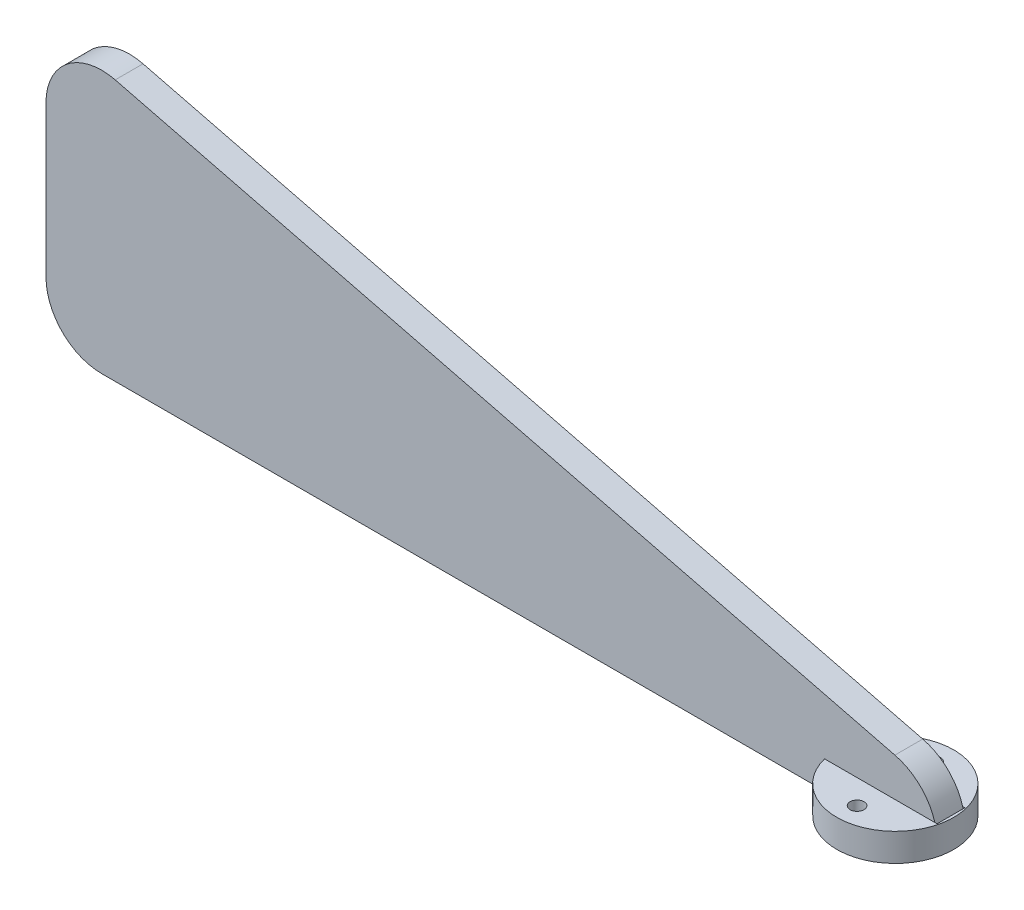
ISO-10303-21;
HEADER;
FILE_DESCRIPTION(('STEP AP214'),'2;1');
FILE_NAME('part.step','',(''),(''),'','','');
FILE_SCHEMA(('AUTOMOTIVE_DESIGN { 1 0 10303 214 1 1 1 1 }'));
ENDSEC;
DATA;
#1=APPLICATION_CONTEXT('core data for automotive mechanical design processes');
#2=APPLICATION_PROTOCOL_DEFINITION('international standard','automotive_design',2000,#1);
#3=PRODUCT_CONTEXT('',#1,'mechanical');
#4=PRODUCT('Part','Part','',(#3));
#5=PRODUCT_RELATED_PRODUCT_CATEGORY('part','',(#4));
#6=PRODUCT_DEFINITION_FORMATION('','',#4);
#7=PRODUCT_DEFINITION_CONTEXT('part definition',#1,'design');
#8=PRODUCT_DEFINITION('design','',#6,#7);
#9=PRODUCT_DEFINITION_SHAPE('','',#8);
#10=(LENGTH_UNIT() NAMED_UNIT(*) SI_UNIT(.MILLI.,.METRE.));
#11=(NAMED_UNIT(*) PLANE_ANGLE_UNIT() SI_UNIT($,.RADIAN.));
#12=(NAMED_UNIT(*) SI_UNIT($,.STERADIAN.) SOLID_ANGLE_UNIT());
#13=UNCERTAINTY_MEASURE_WITH_UNIT(LENGTH_MEASURE(1.E-05),#10,'distance_accuracy_value','');
#14=(GEOMETRIC_REPRESENTATION_CONTEXT(3) GLOBAL_UNCERTAINTY_ASSIGNED_CONTEXT((#13)) GLOBAL_UNIT_ASSIGNED_CONTEXT((#10,
#11,#12)) REPRESENTATION_CONTEXT('',''));
#15=CARTESIAN_POINT('',(0.,0.,0.));
#16=DIRECTION('',(0.,0.,1.));
#17=DIRECTION('',(1.,0.,0.));
#18=AXIS2_PLACEMENT_3D('',#15,#16,#17);
#19=CARTESIAN_POINT('',(150.,2.19223593595586,5.));
#20=DIRECTION('',(0.,0.,-1.));
#21=DIRECTION('',(-1.,0.,0.));
#22=AXIS2_PLACEMENT_3D('',#19,#20,#21);
#23=CYLINDRICAL_SURFACE('',#22,10.);
#24=CARTESIAN_POINT('',(150.,2.19223593595586,0.));
#25=DIRECTION('',(0.,0.,1.));
#26=DIRECTION('',(1.,0.,0.));
#27=AXIS2_PLACEMENT_3D('',#24,#25,#26);
#28=CIRCLE('',#27,10.);
#29=CARTESIAN_POINT('',(160.,2.19223593595586,0.));
#30=VERTEX_POINT('',#29);
#31=CARTESIAN_POINT('',(159.597732073811,5.,0.));
#32=VERTEX_POINT('',#31);
#33=EDGE_CURVE('E119',#30,#32,#28,.T.);
#34=ORIENTED_EDGE('',*,*,#33,.T.);
#35=CARTESIAN_POINT('',(152.425356250363,11.8936609374092,0.));
#36=VERTEX_POINT('',#35);
#37=EDGE_CURVE('E123',#32,#36,#28,.T.);
#38=ORIENTED_EDGE('',*,*,#37,.T.);
#39=DIRECTION('',(0.,0.,-1.));
#40=VECTOR('',#39,1.);
#41=CARTESIAN_POINT('',(152.425356250363,11.8936609374092,5.));
#42=LINE('',#41,#40);
#43=CARTESIAN_POINT('',(152.425356250363,11.8936609374092,5.));
#44=VERTEX_POINT('',#43);
#45=EDGE_CURVE('E137',#44,#36,#42,.T.);
#46=ORIENTED_EDGE('',*,*,#45,.F.);
#47=CARTESIAN_POINT('',(150.,2.19223593595586,5.));
#48=DIRECTION('',(0.,0.,1.));
#49=DIRECTION('',(1.,0.,0.));
#50=AXIS2_PLACEMENT_3D('',#47,#48,#49);
#51=CIRCLE('',#50,10.);
#52=CARTESIAN_POINT('',(159.597732073811,5.,5.));
#53=VERTEX_POINT('',#52);
#54=EDGE_CURVE('E86',#53,#44,#51,.T.);
#55=ORIENTED_EDGE('',*,*,#54,.F.);
#56=CARTESIAN_POINT('',(160.,2.19223593595586,5.));
#57=VERTEX_POINT('',#56);
#58=EDGE_CURVE('E179',#57,#53,#51,.T.);
#59=ORIENTED_EDGE('',*,*,#58,.F.);
#60=DIRECTION('',(0.,0.,-1.));
#61=VECTOR('',#60,1.);
#62=CARTESIAN_POINT('',(160.,2.19223593595586,5.));
#63=LINE('',#62,#61);
#64=EDGE_CURVE('E118',#57,#30,#63,.T.);
#65=ORIENTED_EDGE('',*,*,#64,.T.);
#66=EDGE_LOOP('',(#34,#38,#46,#55,#59,#65));
#67=FACE_BOUND('',#66,.T.);
#68=ADVANCED_FACE('F35',(#67),#23,.T.);
#69=CARTESIAN_POINT('',(152.425356250363,11.8936609374092,5.));
#70=DIRECTION('',(-0.242535625036333,-0.970142500145332,0.));
#71=DIRECTION('',(0.970142500145332,-0.242535625036333,0.));
#72=AXIS2_PLACEMENT_3D('',#69,#70,#71);
#73=PLANE('',#72);
#74=DIRECTION('',(-0.970142500145332,0.242535625036333,0.));
#75=VECTOR('',#74,1.);
#76=CARTESIAN_POINT('',(152.425356250363,11.8936609374092,0.));
#77=LINE('',#76,#75);
#78=CARTESIAN_POINT('',(12.4253562503633,46.8936609374092,0.));
#79=VERTEX_POINT('',#78);
#80=EDGE_CURVE('E122',#36,#79,#77,.T.);
#81=ORIENTED_EDGE('',*,*,#80,.T.);
#82=DIRECTION('',(0.,0.,-1.));
#83=VECTOR('',#82,1.);
#84=CARTESIAN_POINT('',(12.4253562503633,46.8936609374092,5.));
#85=LINE('',#84,#83);
#86=CARTESIAN_POINT('',(12.4253562503633,46.8936609374092,5.));
#87=VERTEX_POINT('',#86);
#88=EDGE_CURVE('E108',#87,#79,#85,.T.);
#89=ORIENTED_EDGE('',*,*,#88,.F.);
#90=DIRECTION('',(-0.970142500145332,0.242535625036333,0.));
#91=VECTOR('',#90,1.);
#92=CARTESIAN_POINT('',(152.425356250363,11.8936609374092,5.));
#93=LINE('',#92,#91);
#94=EDGE_CURVE('E99',#44,#87,#93,.T.);
#95=ORIENTED_EDGE('',*,*,#94,.F.);
#96=ORIENTED_EDGE('',*,*,#45,.T.);
#97=EDGE_LOOP('',(#81,#89,#95,#96));
#98=FACE_BOUND('',#97,.T.);
#99=ADVANCED_FACE('F238',(#98),#73,.F.);
#100=CARTESIAN_POINT('',(10.,37.1922359359558,5.));
#101=DIRECTION('',(0.,0.,-1.));
#102=DIRECTION('',(-1.,0.,0.));
#103=AXIS2_PLACEMENT_3D('',#100,#101,#102);
#104=CYLINDRICAL_SURFACE('',#103,10.);
#105=CARTESIAN_POINT('',(10.,37.1922359359558,0.));
#106=DIRECTION('',(0.,0.,1.));
#107=DIRECTION('',(-1.,0.,0.));
#108=AXIS2_PLACEMENT_3D('',#105,#106,#107);
#109=CIRCLE('',#108,10.);
#110=CARTESIAN_POINT('',(0.,37.1922359359558,0.));
#111=VERTEX_POINT('',#110);
#112=EDGE_CURVE('E107',#79,#111,#109,.T.);
#113=ORIENTED_EDGE('',*,*,#112,.T.);
#114=DIRECTION('',(0.,0.,-1.));
#115=VECTOR('',#114,1.);
#116=CARTESIAN_POINT('',(0.,37.1922359359558,5.));
#117=LINE('',#116,#115);
#118=CARTESIAN_POINT('',(0.,37.1922359359558,5.));
#119=VERTEX_POINT('',#118);
#120=EDGE_CURVE('E104',#119,#111,#117,.T.);
#121=ORIENTED_EDGE('',*,*,#120,.F.);
#122=CARTESIAN_POINT('',(10.,37.1922359359558,5.));
#123=DIRECTION('',(0.,0.,1.));
#124=DIRECTION('',(-1.,0.,0.));
#125=AXIS2_PLACEMENT_3D('',#122,#123,#124);
#126=CIRCLE('',#125,10.);
#127=EDGE_CURVE('E93',#87,#119,#126,.T.);
#128=ORIENTED_EDGE('',*,*,#127,.F.);
#129=ORIENTED_EDGE('',*,*,#88,.T.);
#130=EDGE_LOOP('',(#113,#121,#128,#129));
#131=FACE_BOUND('',#130,.T.);
#132=ADVANCED_FACE('F105',(#131),#104,.T.);
#133=CARTESIAN_POINT('',(0.,10.0000000000001,5.));
#134=DIRECTION('',(1.,0.,0.));
#135=DIRECTION('',(0.,0.,-1.));
#136=AXIS2_PLACEMENT_3D('',#133,#134,#135);
#137=PLANE('',#136);
#138=DIRECTION('',(0.,-1.,0.));
#139=VECTOR('',#138,1.);
#140=CARTESIAN_POINT('',(0.,10.0000000000001,0.));
#141=LINE('',#140,#139);
#142=CARTESIAN_POINT('',(0.,10.0000000000001,0.));
#143=VERTEX_POINT('',#142);
#144=EDGE_CURVE('E72',#111,#143,#141,.T.);
#145=ORIENTED_EDGE('',*,*,#144,.T.);
#146=DIRECTION('',(0.,0.,-1.));
#147=VECTOR('',#146,1.);
#148=CARTESIAN_POINT('',(0.,10.0000000000001,5.));
#149=LINE('',#148,#147);
#150=CARTESIAN_POINT('',(0.,10.0000000000001,5.));
#151=VERTEX_POINT('',#150);
#152=EDGE_CURVE('E109',#151,#143,#149,.T.);
#153=ORIENTED_EDGE('',*,*,#152,.F.);
#154=DIRECTION('',(0.,-1.,0.));
#155=VECTOR('',#154,1.);
#156=CARTESIAN_POINT('',(0.,10.0000000000001,5.));
#157=LINE('',#156,#155);
#158=EDGE_CURVE('E98',#119,#151,#157,.T.);
#159=ORIENTED_EDGE('',*,*,#158,.F.);
#160=ORIENTED_EDGE('',*,*,#120,.T.);
#161=EDGE_LOOP('',(#145,#153,#159,#160));
#162=FACE_BOUND('',#161,.T.);
#163=ADVANCED_FACE('F111',(#162),#137,.F.);
#164=CARTESIAN_POINT('',(10.,10.,5.));
#165=DIRECTION('',(0.,0.,-1.));
#166=DIRECTION('',(-1.,0.,0.));
#167=AXIS2_PLACEMENT_3D('',#164,#165,#166);
#168=CYLINDRICAL_SURFACE('',#167,10.);
#169=CARTESIAN_POINT('',(10.,10.,0.));
#170=DIRECTION('',(0.,0.,1.));
#171=DIRECTION('',(1.,0.,0.));
#172=AXIS2_PLACEMENT_3D('',#169,#170,#171);
#173=CIRCLE('',#172,10.);
#174=CARTESIAN_POINT('',(10.0000000000001,0.,0.));
#175=VERTEX_POINT('',#174);
#176=EDGE_CURVE('E78',#143,#175,#173,.T.);
#177=ORIENTED_EDGE('',*,*,#176,.T.);
#178=DIRECTION('',(0.,0.,-1.));
#179=VECTOR('',#178,1.);
#180=CARTESIAN_POINT('',(10.0000000000001,0.,5.));
#181=LINE('',#180,#179);
#182=CARTESIAN_POINT('',(10.0000000000001,0.,5.));
#183=VERTEX_POINT('',#182);
#184=EDGE_CURVE('E133',#183,#175,#181,.T.);
#185=ORIENTED_EDGE('',*,*,#184,.F.);
#186=CARTESIAN_POINT('',(10.,10.,5.));
#187=DIRECTION('',(0.,0.,1.));
#188=DIRECTION('',(1.,0.,0.));
#189=AXIS2_PLACEMENT_3D('',#186,#187,#188);
#190=CIRCLE('',#189,10.);
#191=EDGE_CURVE('E51',#151,#183,#190,.T.);
#192=ORIENTED_EDGE('',*,*,#191,.F.);
#193=ORIENTED_EDGE('',*,*,#152,.T.);
#194=EDGE_LOOP('',(#177,#185,#192,#193));
#195=FACE_BOUND('',#194,.T.);
#196=ADVANCED_FACE('F250',(#195),#168,.T.);
#197=CARTESIAN_POINT('',(10.0000000000001,0.,5.));
#198=DIRECTION('',(0.,1.,0.));
#199=DIRECTION('',(0.,0.,1.));
#200=AXIS2_PLACEMENT_3D('',#197,#198,#199);
#201=PLANE('',#200);
#202=DIRECTION('',(1.,0.,0.));
#203=VECTOR('',#202,1.);
#204=CARTESIAN_POINT('',(10.0000000000001,0.,0.));
#205=LINE('',#204,#203);
#206=CARTESIAN_POINT('',(139.801960972814,0.,0.));
#207=VERTEX_POINT('',#206);
#208=EDGE_CURVE('E128',#175,#207,#205,.T.);
#209=ORIENTED_EDGE('',*,*,#208,.T.);
#210=CARTESIAN_POINT('',(150.,0.,2.5));
#211=DIRECTION('',(0.,-1.,0.));
#212=DIRECTION('',(0.,0.,-1.));
#213=AXIS2_PLACEMENT_3D('',#210,#211,#212);
#214=CIRCLE('',#213,10.5);
#215=CARTESIAN_POINT('',(139.801960972814,0.,5.));
#216=VERTEX_POINT('',#215);
#217=EDGE_CURVE('E208',#207,#216,#214,.T.);
#218=ORIENTED_EDGE('',*,*,#217,.T.);
#219=DIRECTION('',(1.,0.,0.));
#220=VECTOR('',#219,1.);
#221=CARTESIAN_POINT('',(10.0000000000001,0.,5.));
#222=LINE('',#221,#220);
#223=EDGE_CURVE('E113',#183,#216,#222,.T.);
#224=ORIENTED_EDGE('',*,*,#223,.F.);
#225=ORIENTED_EDGE('',*,*,#184,.T.);
#226=EDGE_LOOP('',(#209,#218,#224,#225));
#227=FACE_BOUND('',#226,.T.);
#228=CARTESIAN_POINT('',(150.,0.,9.37));
#229=DIRECTION('',(0.,-1.,0.));
#230=DIRECTION('',(0.,0.,-1.));
#231=AXIS2_PLACEMENT_3D('',#228,#229,#230);
#232=CIRCLE('',#231,1.25000000000001);
#233=CARTESIAN_POINT('',(150.,0.,8.11999999999999));
#234=VERTEX_POINT('',#233);
#235=EDGE_CURVE('E216',#234,#234,#232,.T.);
#236=ORIENTED_EDGE('',*,*,#235,.F.);
#237=EDGE_LOOP('',(#236));
#238=FACE_BOUND('',#237,.T.);
#239=CARTESIAN_POINT('',(150.,0.,-4.37));
#240=DIRECTION('',(0.,-1.,0.));
#241=DIRECTION('',(0.,0.,-1.));
#242=AXIS2_PLACEMENT_3D('',#239,#240,#241);
#243=CIRCLE('',#242,1.25000000000001);
#244=CARTESIAN_POINT('',(150.,0.,-5.62000000000001));
#245=VERTEX_POINT('',#244);
#246=EDGE_CURVE('E168',#245,#245,#243,.F.);
#247=ORIENTED_EDGE('',*,*,#246,.T.);
#248=EDGE_LOOP('',(#247));
#249=FACE_BOUND('',#248,.T.);
#250=ADVANCED_FACE('F213',(#227,#238,#249),#201,.F.);
#251=CARTESIAN_POINT('',(150.,2.19223593595586,5.));
#252=DIRECTION('',(0.,0.,1.));
#253=DIRECTION('',(1.,0.,0.));
#254=AXIS2_PLACEMENT_3D('',#251,#252,#253);
#255=PLANE('',#254);
#256=DIRECTION('',(0.,-1.,0.));
#257=VECTOR('',#256,1.);
#258=CARTESIAN_POINT('',(139.801960972814,5.,5.));
#259=LINE('',#258,#257);
#260=CARTESIAN_POINT('',(139.801960972814,5.,5.));
#261=VERTEX_POINT('',#260);
#262=EDGE_CURVE('E174',#261,#216,#259,.T.);
#263=ORIENTED_EDGE('',*,*,#262,.F.);
#264=DIRECTION('',(1.,0.,0.));
#265=VECTOR('',#264,1.);
#266=CARTESIAN_POINT('',(150.,5.,5.));
#267=LINE('',#266,#265);
#268=EDGE_CURVE('E192',#261,#53,#267,.T.);
#269=ORIENTED_EDGE('',*,*,#268,.T.);
#270=ORIENTED_EDGE('',*,*,#54,.T.);
#271=ORIENTED_EDGE('',*,*,#94,.T.);
#272=ORIENTED_EDGE('',*,*,#127,.T.);
#273=ORIENTED_EDGE('',*,*,#158,.T.);
#274=ORIENTED_EDGE('',*,*,#191,.T.);
#275=ORIENTED_EDGE('',*,*,#223,.T.);
#276=EDGE_LOOP('',(#263,#269,#270,#271,#272,#273,#274,#275));
#277=FACE_BOUND('',#276,.T.);
#278=ADVANCED_FACE('F96',(#277),#255,.T.);
#279=CARTESIAN_POINT('',(150.,2.19223593595586,0.));
#280=DIRECTION('',(0.,0.,1.));
#281=DIRECTION('',(1.,0.,0.));
#282=AXIS2_PLACEMENT_3D('',#279,#280,#281);
#283=PLANE('',#282);
#284=DIRECTION('',(1.,0.,0.));
#285=VECTOR('',#284,1.);
#286=CARTESIAN_POINT('',(150.,5.,0.));
#287=LINE('',#286,#285);
#288=CARTESIAN_POINT('',(139.801960972814,5.,0.));
#289=VERTEX_POINT('',#288);
#290=EDGE_CURVE('E43',#289,#32,#287,.T.);
#291=ORIENTED_EDGE('',*,*,#290,.F.);
#292=DIRECTION('',(0.,-1.,0.));
#293=VECTOR('',#292,1.);
#294=CARTESIAN_POINT('',(139.801960972814,5.,0.));
#295=LINE('',#294,#293);
#296=EDGE_CURVE('E11',#289,#207,#295,.T.);
#297=ORIENTED_EDGE('',*,*,#296,.T.);
#298=ORIENTED_EDGE('',*,*,#208,.F.);
#299=ORIENTED_EDGE('',*,*,#176,.F.);
#300=ORIENTED_EDGE('',*,*,#144,.F.);
#301=ORIENTED_EDGE('',*,*,#112,.F.);
#302=ORIENTED_EDGE('',*,*,#80,.F.);
#303=ORIENTED_EDGE('',*,*,#37,.F.);
#304=EDGE_LOOP('',(#291,#297,#298,#299,#300,#301,#302,#303));
#305=FACE_BOUND('',#304,.T.);
#306=ADVANCED_FACE('F171',(#305),#283,.F.);
#307=CARTESIAN_POINT('',(0.,5.,0.));
#308=DIRECTION('',(0.,0.,-1.));
#309=DIRECTION('',(-1.,0.,0.));
#310=AXIS2_PLACEMENT_3D('',#307,#308,#309);
#311=PLANE('',#310);
#312=DIRECTION('',(1.,0.,0.));
#313=VECTOR('',#312,1.);
#314=CARTESIAN_POINT('',(0.,5.,0.));
#315=LINE('',#314,#313);
#316=CARTESIAN_POINT('',(160.,5.,0.));
#317=VERTEX_POINT('',#316);
#318=EDGE_CURVE('E151',#32,#317,#315,.T.);
#319=ORIENTED_EDGE('',*,*,#318,.F.);
#320=ORIENTED_EDGE('',*,*,#33,.F.);
#321=DIRECTION('',(0.,-1.,0.));
#322=VECTOR('',#321,1.);
#323=CARTESIAN_POINT('',(160.,5.,0.));
#324=LINE('',#323,#322);
#325=EDGE_CURVE('E166',#317,#30,#324,.T.);
#326=ORIENTED_EDGE('',*,*,#325,.F.);
#327=EDGE_LOOP('',(#319,#320,#326));
#328=FACE_BOUND('',#327,.T.);
#329=ADVANCED_FACE('F164',(#328),#311,.F.);
#330=CARTESIAN_POINT('',(0.,5.,5.));
#331=DIRECTION('',(0.,0.,1.));
#332=DIRECTION('',(1.,0.,0.));
#333=AXIS2_PLACEMENT_3D('',#330,#331,#332);
#334=PLANE('',#333);
#335=DIRECTION('',(0.,-1.,0.));
#336=VECTOR('',#335,1.);
#337=CARTESIAN_POINT('',(160.,5.,5.));
#338=LINE('',#337,#336);
#339=CARTESIAN_POINT('',(160.,5.,5.));
#340=VERTEX_POINT('',#339);
#341=EDGE_CURVE('E185',#340,#57,#338,.T.);
#342=ORIENTED_EDGE('',*,*,#341,.T.);
#343=ORIENTED_EDGE('',*,*,#58,.T.);
#344=DIRECTION('',(-1.,0.,0.));
#345=VECTOR('',#344,1.);
#346=CARTESIAN_POINT('',(0.,5.,5.));
#347=LINE('',#346,#345);
#348=EDGE_CURVE('E167',#340,#53,#347,.T.);
#349=ORIENTED_EDGE('',*,*,#348,.F.);
#350=EDGE_LOOP('',(#342,#343,#349));
#351=FACE_BOUND('',#350,.T.);
#352=ADVANCED_FACE('F188',(#351),#334,.F.);
#353=CARTESIAN_POINT('',(160.,5.,0.));
#354=DIRECTION('',(1.,0.,0.));
#355=DIRECTION('',(0.,0.,-1.));
#356=AXIS2_PLACEMENT_3D('',#353,#354,#355);
#357=PLANE('',#356);
#358=ORIENTED_EDGE('',*,*,#64,.F.);
#359=ORIENTED_EDGE('',*,*,#341,.F.);
#360=DIRECTION('',(0.,0.,1.));
#361=VECTOR('',#360,1.);
#362=CARTESIAN_POINT('',(160.,5.,0.));
#363=LINE('',#362,#361);
#364=EDGE_CURVE('E272',#317,#340,#363,.T.);
#365=ORIENTED_EDGE('',*,*,#364,.F.);
#366=ORIENTED_EDGE('',*,*,#325,.T.);
#367=EDGE_LOOP('',(#358,#359,#365,#366));
#368=FACE_BOUND('',#367,.T.);
#369=ADVANCED_FACE('F183',(#368),#357,.F.);
#370=CARTESIAN_POINT('',(150.,5.,9.37));
#371=DIRECTION('',(0.,-1.,0.));
#372=DIRECTION('',(0.,0.,-1.));
#373=AXIS2_PLACEMENT_3D('',#370,#371,#372);
#374=CYLINDRICAL_SURFACE('',#373,1.25000000000001);
#375=CARTESIAN_POINT('',(150.,5.,9.37));
#376=DIRECTION('',(0.,-1.,0.));
#377=DIRECTION('',(0.,0.,-1.));
#378=AXIS2_PLACEMENT_3D('',#375,#376,#377);
#379=CIRCLE('',#378,1.25000000000001);
#380=CARTESIAN_POINT('',(150.,5.,8.11999999999999));
#381=VERTEX_POINT('',#380);
#382=EDGE_CURVE('E195',#381,#381,#379,.T.);
#383=ORIENTED_EDGE('',*,*,#382,.F.);
#384=EDGE_LOOP('',(#383));
#385=FACE_BOUND('',#384,.T.);
#386=ORIENTED_EDGE('',*,*,#235,.T.);
#387=EDGE_LOOP('',(#386));
#388=FACE_BOUND('',#387,.T.);
#389=ADVANCED_FACE('F234',(#385,#388),#374,.F.);
#390=CARTESIAN_POINT('',(150.,5.,2.5));
#391=DIRECTION('',(0.,-1.,0.));
#392=DIRECTION('',(0.,0.,-1.));
#393=AXIS2_PLACEMENT_3D('',#390,#391,#392);
#394=CYLINDRICAL_SURFACE('',#393,10.5);
#395=CARTESIAN_POINT('',(150.,5.,2.5));
#396=DIRECTION('',(0.,-1.,0.));
#397=DIRECTION('',(0.,0.,-1.));
#398=AXIS2_PLACEMENT_3D('',#395,#396,#397);
#399=CIRCLE('',#398,10.5);
#400=EDGE_CURVE('E155',#289,#261,#399,.T.);
#401=ORIENTED_EDGE('',*,*,#400,.T.);
#402=ORIENTED_EDGE('',*,*,#262,.T.);
#403=ORIENTED_EDGE('',*,*,#217,.F.);
#404=ORIENTED_EDGE('',*,*,#296,.F.);
#405=EDGE_LOOP('',(#401,#402,#403,#404));
#406=FACE_BOUND('',#405,.T.);
#407=ADVANCED_FACE('F206',(#406),#394,.T.);
#408=CARTESIAN_POINT('',(150.,5.,-4.37));
#409=DIRECTION('',(0.,-1.,0.));
#410=DIRECTION('',(0.,0.,-1.));
#411=AXIS2_PLACEMENT_3D('',#408,#409,#410);
#412=CYLINDRICAL_SURFACE('',#411,1.25000000000001);
#413=CARTESIAN_POINT('',(150.,5.,-4.37));
#414=DIRECTION('',(0.,-1.,0.));
#415=DIRECTION('',(0.,0.,-1.));
#416=AXIS2_PLACEMENT_3D('',#413,#414,#415);
#417=CIRCLE('',#416,1.25000000000001);
#418=CARTESIAN_POINT('',(150.,5.,-5.62000000000001));
#419=VERTEX_POINT('',#418);
#420=EDGE_CURVE('E190',#419,#419,#417,.F.);
#421=ORIENTED_EDGE('',*,*,#420,.T.);
#422=EDGE_LOOP('',(#421));
#423=FACE_BOUND('',#422,.T.);
#424=ORIENTED_EDGE('',*,*,#246,.F.);
#425=EDGE_LOOP('',(#424));
#426=FACE_BOUND('',#425,.T.);
#427=ADVANCED_FACE('F225',(#423,#426),#412,.F.);
#428=CARTESIAN_POINT('',(0.,5.,0.));
#429=DIRECTION('',(0.,-1.,0.));
#430=DIRECTION('',(0.,0.,-1.));
#431=AXIS2_PLACEMENT_3D('',#428,#429,#430);
#432=PLANE('',#431);
#433=ORIENTED_EDGE('',*,*,#268,.F.);
#434=ORIENTED_EDGE('',*,*,#400,.F.);
#435=ORIENTED_EDGE('',*,*,#290,.T.);
#436=ORIENTED_EDGE('',*,*,#318,.T.);
#437=ORIENTED_EDGE('',*,*,#364,.T.);
#438=ORIENTED_EDGE('',*,*,#348,.T.);
#439=EDGE_LOOP('',(#433,#434,#435,#436,#437,#438));
#440=FACE_BOUND('',#439,.T.);
#441=ORIENTED_EDGE('',*,*,#382,.T.);
#442=EDGE_LOOP('',(#441));
#443=FACE_BOUND('',#442,.T.);
#444=ORIENTED_EDGE('',*,*,#420,.F.);
#445=EDGE_LOOP('',(#444));
#446=FACE_BOUND('',#445,.T.);
#447=ADVANCED_FACE('F147',(#440,#443,#446),#432,.F.);
#448=CLOSED_SHELL('',(#68,#99,#132,#163,#196,#250,#278,#306,#329,#352,#369,#389,#407,#427,#447));
#449=MANIFOLD_SOLID_BREP('B2',#448);
#450=ADVANCED_BREP_SHAPE_REPRESENTATION('',(#18,#449),#14);
#451=SHAPE_DEFINITION_REPRESENTATION(#9,#450);
ENDSEC;
END-ISO-10303-21;
